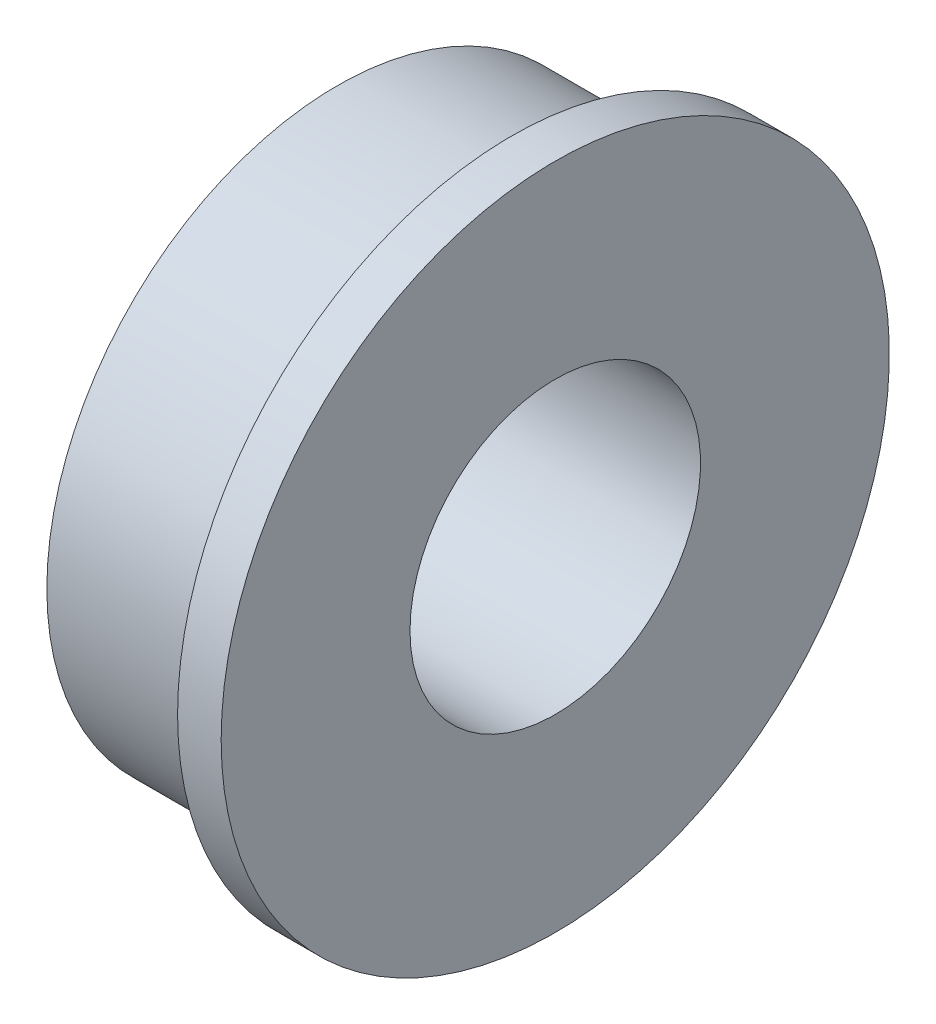
ISO-10303-21;
HEADER;
FILE_DESCRIPTION(('STEP AP214'),'2;1');
FILE_NAME('part.step','',(''),(''),'','','');
FILE_SCHEMA(('AUTOMOTIVE_DESIGN { 1 0 10303 214 1 1 1 1 }'));
ENDSEC;
DATA;
#1=APPLICATION_CONTEXT('core data for automotive mechanical design processes');
#2=APPLICATION_PROTOCOL_DEFINITION('international standard','automotive_design',2000,#1);
#3=PRODUCT_CONTEXT('',#1,'mechanical');
#4=PRODUCT('Part','Part','',(#3));
#5=PRODUCT_RELATED_PRODUCT_CATEGORY('part','',(#4));
#6=PRODUCT_DEFINITION_FORMATION('','',#4);
#7=PRODUCT_DEFINITION_CONTEXT('part definition',#1,'design');
#8=PRODUCT_DEFINITION('design','',#6,#7);
#9=PRODUCT_DEFINITION_SHAPE('','',#8);
#10=(LENGTH_UNIT() NAMED_UNIT(*) SI_UNIT(.MILLI.,.METRE.));
#11=(NAMED_UNIT(*) PLANE_ANGLE_UNIT() SI_UNIT($,.RADIAN.));
#12=(NAMED_UNIT(*) SI_UNIT($,.STERADIAN.) SOLID_ANGLE_UNIT());
#13=UNCERTAINTY_MEASURE_WITH_UNIT(LENGTH_MEASURE(1.E-05),#10,'distance_accuracy_value','');
#14=(GEOMETRIC_REPRESENTATION_CONTEXT(3) GLOBAL_UNCERTAINTY_ASSIGNED_CONTEXT((#13)) GLOBAL_UNIT_ASSIGNED_CONTEXT((#10,
#11,#12)) REPRESENTATION_CONTEXT('',''));
#15=CARTESIAN_POINT('',(0.,0.,0.));
#16=DIRECTION('',(0.,0.,1.));
#17=DIRECTION('',(1.,0.,0.));
#18=AXIS2_PLACEMENT_3D('',#15,#16,#17);
#19=CARTESIAN_POINT('',(0.,4.,0.));
#20=DIRECTION('',(1.,0.,0.));
#21=DIRECTION('',(0.,0.,-1.));
#22=AXIS2_PLACEMENT_3D('',#19,#20,#21);
#23=PLANE('',#22);
#24=CARTESIAN_POINT('',(0.,0.,0.));
#25=DIRECTION('',(-1.,0.,0.));
#26=DIRECTION('',(0.,0.,1.));
#27=AXIS2_PLACEMENT_3D('',#24,#25,#26);
#28=CIRCLE('',#27,2.);
#29=CARTESIAN_POINT('',(0.,0.,2.));
#30=VERTEX_POINT('',#29);
#31=EDGE_CURVE('E10',#30,#30,#28,.T.);
#32=ORIENTED_EDGE('',*,*,#31,.F.);
#33=EDGE_LOOP('',(#32));
#34=FACE_BOUND('',#33,.T.);
#35=CARTESIAN_POINT('',(0.,0.,0.));
#36=DIRECTION('',(-1.,0.,0.));
#37=DIRECTION('',(0.,0.,1.));
#38=AXIS2_PLACEMENT_3D('',#35,#36,#37);
#39=CIRCLE('',#38,4.);
#40=CARTESIAN_POINT('',(0.,0.,4.));
#41=VERTEX_POINT('',#40);
#42=EDGE_CURVE('E53',#41,#41,#39,.T.);
#43=ORIENTED_EDGE('',*,*,#42,.T.);
#44=EDGE_LOOP('',(#43));
#45=FACE_BOUND('',#44,.T.);
#46=ADVANCED_FACE('F31',(#34,#45),#23,.F.);
#47=CARTESIAN_POINT('',(0.,0.,0.));
#48=DIRECTION('',(-1.,0.,0.));
#49=DIRECTION('',(0.,0.,1.));
#50=AXIS2_PLACEMENT_3D('',#47,#48,#49);
#51=CYLINDRICAL_SURFACE('',#50,2.);
#52=CARTESIAN_POINT('',(3.,0.,0.));
#53=DIRECTION('',(-1.,0.,0.));
#54=DIRECTION('',(0.,0.,1.));
#55=AXIS2_PLACEMENT_3D('',#52,#53,#54);
#56=CIRCLE('',#55,2.);
#57=CARTESIAN_POINT('',(3.,0.,2.));
#58=VERTEX_POINT('',#57);
#59=EDGE_CURVE('E37',#58,#58,#56,.T.);
#60=ORIENTED_EDGE('',*,*,#59,.F.);
#61=EDGE_LOOP('',(#60));
#62=FACE_BOUND('',#61,.T.);
#63=ORIENTED_EDGE('',*,*,#31,.T.);
#64=EDGE_LOOP('',(#63));
#65=FACE_BOUND('',#64,.T.);
#66=ADVANCED_FACE('F78',(#62,#65),#51,.F.);
#67=CARTESIAN_POINT('',(3.,2.,0.));
#68=DIRECTION('',(-1.,0.,0.));
#69=DIRECTION('',(0.,0.,1.));
#70=AXIS2_PLACEMENT_3D('',#67,#68,#69);
#71=PLANE('',#70);
#72=CARTESIAN_POINT('',(3.,0.,0.));
#73=DIRECTION('',(-1.,0.,0.));
#74=DIRECTION('',(0.,0.,1.));
#75=AXIS2_PLACEMENT_3D('',#72,#73,#74);
#76=CIRCLE('',#75,4.6);
#77=CARTESIAN_POINT('',(3.,0.,4.6));
#78=VERTEX_POINT('',#77);
#79=EDGE_CURVE('E41',#78,#78,#76,.T.);
#80=ORIENTED_EDGE('',*,*,#79,.F.);
#81=EDGE_LOOP('',(#80));
#82=FACE_BOUND('',#81,.T.);
#83=ORIENTED_EDGE('',*,*,#59,.T.);
#84=EDGE_LOOP('',(#83));
#85=FACE_BOUND('',#84,.T.);
#86=ADVANCED_FACE('F73',(#82,#85),#71,.F.);
#87=CARTESIAN_POINT('',(0.,0.,0.));
#88=DIRECTION('',(-1.,0.,0.));
#89=DIRECTION('',(0.,0.,1.));
#90=AXIS2_PLACEMENT_3D('',#87,#88,#89);
#91=CYLINDRICAL_SURFACE('',#90,4.6);
#92=CARTESIAN_POINT('',(2.4,0.,0.));
#93=DIRECTION('',(-1.,0.,0.));
#94=DIRECTION('',(0.,0.,1.));
#95=AXIS2_PLACEMENT_3D('',#92,#93,#94);
#96=CIRCLE('',#95,4.6);
#97=CARTESIAN_POINT('',(2.4,0.,4.6));
#98=VERTEX_POINT('',#97);
#99=EDGE_CURVE('E45',#98,#98,#96,.T.);
#100=ORIENTED_EDGE('',*,*,#99,.F.);
#101=EDGE_LOOP('',(#100));
#102=FACE_BOUND('',#101,.T.);
#103=ORIENTED_EDGE('',*,*,#79,.T.);
#104=EDGE_LOOP('',(#103));
#105=FACE_BOUND('',#104,.T.);
#106=ADVANCED_FACE('F67',(#102,#105),#91,.T.);
#107=CARTESIAN_POINT('',(2.4,4.6,0.));
#108=DIRECTION('',(1.,0.,0.));
#109=DIRECTION('',(0.,0.,-1.));
#110=AXIS2_PLACEMENT_3D('',#107,#108,#109);
#111=PLANE('',#110);
#112=CARTESIAN_POINT('',(2.4,0.,0.));
#113=DIRECTION('',(-1.,0.,0.));
#114=DIRECTION('',(0.,0.,1.));
#115=AXIS2_PLACEMENT_3D('',#112,#113,#114);
#116=CIRCLE('',#115,4.);
#117=CARTESIAN_POINT('',(2.4,0.,4.));
#118=VERTEX_POINT('',#117);
#119=EDGE_CURVE('E50',#118,#118,#116,.T.);
#120=ORIENTED_EDGE('',*,*,#119,.F.);
#121=EDGE_LOOP('',(#120));
#122=FACE_BOUND('',#121,.T.);
#123=ORIENTED_EDGE('',*,*,#99,.T.);
#124=EDGE_LOOP('',(#123));
#125=FACE_BOUND('',#124,.T.);
#126=ADVANCED_FACE('F61',(#122,#125),#111,.F.);
#127=CARTESIAN_POINT('',(0.,0.,0.));
#128=DIRECTION('',(-1.,0.,0.));
#129=DIRECTION('',(0.,0.,1.));
#130=AXIS2_PLACEMENT_3D('',#127,#128,#129);
#131=CYLINDRICAL_SURFACE('',#130,4.);
#132=ORIENTED_EDGE('',*,*,#42,.F.);
#133=EDGE_LOOP('',(#132));
#134=FACE_BOUND('',#133,.T.);
#135=ORIENTED_EDGE('',*,*,#119,.T.);
#136=EDGE_LOOP('',(#135));
#137=FACE_BOUND('',#136,.T.);
#138=ADVANCED_FACE('F58',(#134,#137),#131,.T.);
#139=CLOSED_SHELL('',(#46,#66,#86,#106,#126,#138));
#140=MANIFOLD_SOLID_BREP('B2',#139);
#141=ADVANCED_BREP_SHAPE_REPRESENTATION('',(#18,#140),#14);
#142=SHAPE_DEFINITION_REPRESENTATION(#9,#141);
ENDSEC;
END-ISO-10303-21;
